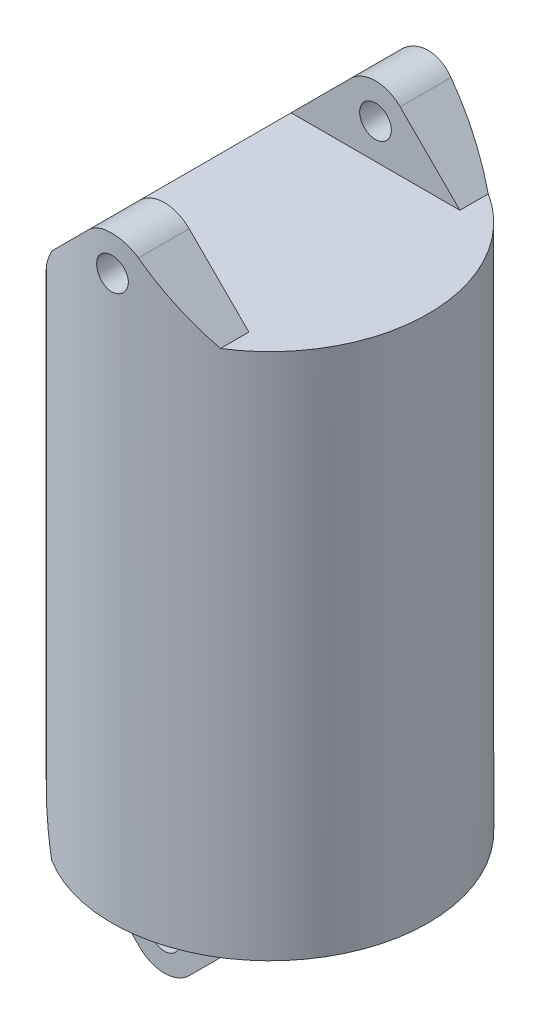
ISO-10303-21;
HEADER;
FILE_DESCRIPTION(('STEP AP214'),'2;1');
FILE_NAME('part.step','',(''),(''),'','','');
FILE_SCHEMA(('AUTOMOTIVE_DESIGN { 1 0 10303 214 1 1 1 1 }'));
ENDSEC;
DATA;
#1=APPLICATION_CONTEXT('core data for automotive mechanical design processes');
#2=APPLICATION_PROTOCOL_DEFINITION('international standard','automotive_design',2000,#1);
#3=PRODUCT_CONTEXT('',#1,'mechanical');
#4=PRODUCT('Part','Part','',(#3));
#5=PRODUCT_RELATED_PRODUCT_CATEGORY('part','',(#4));
#6=PRODUCT_DEFINITION_FORMATION('','',#4);
#7=PRODUCT_DEFINITION_CONTEXT('part definition',#1,'design');
#8=PRODUCT_DEFINITION('design','',#6,#7);
#9=PRODUCT_DEFINITION_SHAPE('','',#8);
#10=(LENGTH_UNIT() NAMED_UNIT(*) SI_UNIT(.MILLI.,.METRE.));
#11=(NAMED_UNIT(*) PLANE_ANGLE_UNIT() SI_UNIT($,.RADIAN.));
#12=(NAMED_UNIT(*) SI_UNIT($,.STERADIAN.) SOLID_ANGLE_UNIT());
#13=UNCERTAINTY_MEASURE_WITH_UNIT(LENGTH_MEASURE(1.E-05),#10,'distance_accuracy_value','');
#14=(GEOMETRIC_REPRESENTATION_CONTEXT(3) GLOBAL_UNCERTAINTY_ASSIGNED_CONTEXT((#13)) GLOBAL_UNIT_ASSIGNED_CONTEXT((#10,
#11,#12)) REPRESENTATION_CONTEXT('',''));
#15=CARTESIAN_POINT('',(0.,0.,0.));
#16=DIRECTION('',(0.,0.,1.));
#17=DIRECTION('',(1.,0.,0.));
#18=AXIS2_PLACEMENT_3D('',#15,#16,#17);
#19=CARTESIAN_POINT('',(8.,50.,15.));
#20=DIRECTION('',(-0.707106781186548,-0.707106781186547,0.));
#21=DIRECTION('',(0.707106781186547,-0.707106781186548,0.));
#22=AXIS2_PLACEMENT_3D('',#19,#20,#21);
#23=PLANE('',#22);
#24=DIRECTION('',(0.,0.,-1.));
#25=VECTOR('',#24,1.);
#26=CARTESIAN_POINT('',(2.34314575050762,55.6568542494924,15.));
#27=LINE('',#26,#25);
#28=CARTESIAN_POINT('',(2.34314575050762,55.6568542494924,14.8158586653585));
#29=VERTEX_POINT('',#28);
#30=CARTESIAN_POINT('',(2.34314575050762,55.6568542494924,10.));
#31=VERTEX_POINT('',#30);
#32=EDGE_CURVE('E167',#29,#31,#27,.T.);
#33=ORIENTED_EDGE('',*,*,#32,.F.);
#34=CARTESIAN_POINT('',(0.,58.,0.));
#35=DIRECTION('',(-0.707106781186548,-0.707106781186547,0.));
#36=DIRECTION('',(0.707106781186547,-0.707106781186548,0.));
#37=AXIS2_PLACEMENT_3D('',#34,#35,#36);
#38=ELLIPSE('',#37,21.2132034355964,15.);
#39=CARTESIAN_POINT('',(8.,50.,12.6885775404495));
#40=VERTEX_POINT('',#39);
#41=EDGE_CURVE('E165',#29,#40,#38,.F.);
#42=ORIENTED_EDGE('',*,*,#41,.T.);
#43=DIRECTION('',(0.,0.,-1.));
#44=VECTOR('',#43,1.);
#45=CARTESIAN_POINT('',(8.,50.,15.));
#46=LINE('',#45,#44);
#47=CARTESIAN_POINT('',(8.,50.,10.));
#48=VERTEX_POINT('',#47);
#49=EDGE_CURVE('E55',#40,#48,#46,.T.);
#50=ORIENTED_EDGE('',*,*,#49,.T.);
#51=DIRECTION('',(-0.707106781186547,0.707106781186548,0.));
#52=VECTOR('',#51,1.);
#53=CARTESIAN_POINT('',(8.,50.,10.));
#54=LINE('',#53,#52);
#55=EDGE_CURVE('E290',#48,#31,#54,.T.);
#56=ORIENTED_EDGE('',*,*,#55,.T.);
#57=EDGE_LOOP('',(#33,#42,#50,#56));
#58=FACE_BOUND('',#57,.T.);
#59=ADVANCED_FACE('F39',(#58),#23,.F.);
#60=CARTESIAN_POINT('',(-8.,50.,15.));
#61=DIRECTION('',(0.707106781186548,-0.707106781186547,0.));
#62=DIRECTION('',(0.707106781186547,0.707106781186548,0.));
#63=AXIS2_PLACEMENT_3D('',#60,#61,#62);
#64=PLANE('',#63);
#65=DIRECTION('',(0.,0.,1.));
#66=VECTOR('',#65,1.);
#67=CARTESIAN_POINT('',(-8.,50.,-25.));
#68=LINE('',#67,#66);
#69=CARTESIAN_POINT('',(-8.,50.,10.));
#70=VERTEX_POINT('',#69);
#71=CARTESIAN_POINT('',(-8.,50.,12.6885775404495));
#72=VERTEX_POINT('',#71);
#73=EDGE_CURVE('E272',#70,#72,#68,.T.);
#74=ORIENTED_EDGE('',*,*,#73,.T.);
#75=CARTESIAN_POINT('',(0.,58.,0.));
#76=DIRECTION('',(0.707106781186548,-0.707106781186547,0.));
#77=DIRECTION('',(-0.707106781186547,-0.707106781186548,0.));
#78=AXIS2_PLACEMENT_3D('',#75,#76,#77);
#79=ELLIPSE('',#78,21.2132034355964,15.);
#80=CARTESIAN_POINT('',(-2.34314575050762,55.6568542494924,14.8158586653585));
#81=VERTEX_POINT('',#80);
#82=EDGE_CURVE('E169',#72,#81,#79,.F.);
#83=ORIENTED_EDGE('',*,*,#82,.T.);
#84=DIRECTION('',(0.,0.,-1.));
#85=VECTOR('',#84,1.);
#86=CARTESIAN_POINT('',(-2.34314575050762,55.6568542494924,15.));
#87=LINE('',#86,#85);
#88=CARTESIAN_POINT('',(-2.34314575050762,55.6568542494924,10.));
#89=VERTEX_POINT('',#88);
#90=EDGE_CURVE('E276',#81,#89,#87,.T.);
#91=ORIENTED_EDGE('',*,*,#90,.T.);
#92=DIRECTION('',(-0.707106781186547,-0.707106781186548,0.));
#93=VECTOR('',#92,1.);
#94=CARTESIAN_POINT('',(-8.,50.,10.));
#95=LINE('',#94,#93);
#96=EDGE_CURVE('E283',#89,#70,#95,.T.);
#97=ORIENTED_EDGE('',*,*,#96,.T.);
#98=EDGE_LOOP('',(#74,#83,#91,#97));
#99=FACE_BOUND('',#98,.T.);
#100=ADVANCED_FACE('F356',(#99),#64,.F.);
#101=CARTESIAN_POINT('',(-8.,50.,-15.));
#102=DIRECTION('',(-0.707106781186548,0.707106781186547,0.));
#103=DIRECTION('',(-0.707106781186547,-0.707106781186548,0.));
#104=AXIS2_PLACEMENT_3D('',#101,#102,#103);
#105=PLANE('',#104);
#106=CARTESIAN_POINT('',(0.,58.,0.));
#107=DIRECTION('',(-0.707106781186548,0.707106781186547,0.));
#108=DIRECTION('',(-0.707106781186547,-0.707106781186548,0.));
#109=AXIS2_PLACEMENT_3D('',#106,#107,#108);
#110=ELLIPSE('',#109,21.2132034355964,15.);
#111=CARTESIAN_POINT('',(-8.,50.,-12.6885775404495));
#112=VERTEX_POINT('',#111);
#113=CARTESIAN_POINT('',(-2.34314575050762,55.6568542494924,-14.8158586653585));
#114=VERTEX_POINT('',#113);
#115=EDGE_CURVE('E342',#112,#114,#110,.F.);
#116=ORIENTED_EDGE('',*,*,#115,.F.);
#117=CARTESIAN_POINT('',(-8.,50.,-10.));
#118=VERTEX_POINT('',#117);
#119=EDGE_CURVE('E177',#112,#118,#68,.T.);
#120=ORIENTED_EDGE('',*,*,#119,.T.);
#121=DIRECTION('',(-0.707106781186547,-0.707106781186548,0.));
#122=VECTOR('',#121,1.);
#123=CARTESIAN_POINT('',(-8.,50.,-10.));
#124=LINE('',#123,#122);
#125=CARTESIAN_POINT('',(-2.34314575050762,55.6568542494924,-10.));
#126=VERTEX_POINT('',#125);
#127=EDGE_CURVE('E304',#126,#118,#124,.T.);
#128=ORIENTED_EDGE('',*,*,#127,.F.);
#129=DIRECTION('',(0.,0.,1.));
#130=VECTOR('',#129,1.);
#131=CARTESIAN_POINT('',(-2.34314575050762,55.6568542494924,-15.));
#132=LINE('',#131,#130);
#133=EDGE_CURVE('E291',#114,#126,#132,.T.);
#134=ORIENTED_EDGE('',*,*,#133,.F.);
#135=EDGE_LOOP('',(#116,#120,#128,#134));
#136=FACE_BOUND('',#135,.T.);
#137=ADVANCED_FACE('F355',(#136),#105,.T.);
#138=CARTESIAN_POINT('',(8.,50.,-15.));
#139=DIRECTION('',(0.707106781186548,0.707106781186547,0.));
#140=DIRECTION('',(-0.707106781186547,0.707106781186548,0.));
#141=AXIS2_PLACEMENT_3D('',#138,#139,#140);
#142=PLANE('',#141);
#143=CARTESIAN_POINT('',(0.,58.,0.));
#144=DIRECTION('',(0.707106781186548,0.707106781186547,0.));
#145=DIRECTION('',(0.707106781186547,-0.707106781186548,0.));
#146=AXIS2_PLACEMENT_3D('',#143,#144,#145);
#147=ELLIPSE('',#146,21.2132034355964,15.);
#148=CARTESIAN_POINT('',(2.34314575050762,55.6568542494924,-14.8158586653585));
#149=VERTEX_POINT('',#148);
#150=CARTESIAN_POINT('',(8.,50.,-12.6885775404495));
#151=VERTEX_POINT('',#150);
#152=EDGE_CURVE('E181',#149,#151,#147,.F.);
#153=ORIENTED_EDGE('',*,*,#152,.F.);
#154=DIRECTION('',(0.,0.,1.));
#155=VECTOR('',#154,1.);
#156=CARTESIAN_POINT('',(2.34314575050762,55.6568542494924,-15.));
#157=LINE('',#156,#155);
#158=CARTESIAN_POINT('',(2.34314575050762,55.6568542494924,-10.));
#159=VERTEX_POINT('',#158);
#160=EDGE_CURVE('E293',#149,#159,#157,.T.);
#161=ORIENTED_EDGE('',*,*,#160,.T.);
#162=DIRECTION('',(-0.707106781186547,0.707106781186548,0.));
#163=VECTOR('',#162,1.);
#164=CARTESIAN_POINT('',(8.,50.,-10.));
#165=LINE('',#164,#163);
#166=CARTESIAN_POINT('',(8.,50.,-10.));
#167=VERTEX_POINT('',#166);
#168=EDGE_CURVE('E300',#167,#159,#165,.T.);
#169=ORIENTED_EDGE('',*,*,#168,.F.);
#170=DIRECTION('',(0.,0.,1.));
#171=VECTOR('',#170,1.);
#172=CARTESIAN_POINT('',(8.,50.,-15.));
#173=LINE('',#172,#171);
#174=EDGE_CURVE('E299',#151,#167,#173,.T.);
#175=ORIENTED_EDGE('',*,*,#174,.F.);
#176=EDGE_LOOP('',(#153,#161,#169,#175));
#177=FACE_BOUND('',#176,.T.);
#178=ADVANCED_FACE('F352',(#177),#142,.T.);
#179=CARTESIAN_POINT('',(0.,50.,0.));
#180=DIRECTION('',(0.,1.,0.));
#181=DIRECTION('',(0.,0.,1.));
#182=AXIS2_PLACEMENT_3D('',#179,#180,#181);
#183=PLANE('',#182);
#184=DIRECTION('',(1.,0.,0.));
#185=VECTOR('',#184,1.);
#186=CARTESIAN_POINT('',(-8.,50.,-10.));
#187=LINE('',#186,#185);
#188=EDGE_CURVE('E306',#118,#167,#187,.T.);
#189=ORIENTED_EDGE('',*,*,#188,.F.);
#190=EDGE_CURVE('E277',#118,#70,#68,.T.);
#191=ORIENTED_EDGE('',*,*,#190,.T.);
#192=DIRECTION('',(1.,0.,0.));
#193=VECTOR('',#192,1.);
#194=CARTESIAN_POINT('',(-8.,50.,10.));
#195=LINE('',#194,#193);
#196=EDGE_CURVE('E178',#70,#48,#195,.T.);
#197=ORIENTED_EDGE('',*,*,#196,.T.);
#198=ORIENTED_EDGE('',*,*,#49,.F.);
#199=CARTESIAN_POINT('',(0.,50.,0.));
#200=DIRECTION('',(0.,1.,0.));
#201=DIRECTION('',(0.,0.,1.));
#202=AXIS2_PLACEMENT_3D('',#199,#200,#201);
#203=CIRCLE('',#202,15.);
#204=EDGE_CURVE('E176',#40,#151,#203,.T.);
#205=ORIENTED_EDGE('',*,*,#204,.T.);
#206=ORIENTED_EDGE('',*,*,#174,.T.);
#207=EDGE_LOOP('',(#189,#191,#197,#198,#205,#206));
#208=FACE_BOUND('',#207,.T.);
#209=ADVANCED_FACE('F175',(#208),#183,.T.);
#210=CARTESIAN_POINT('',(0.,50.,0.));
#211=DIRECTION('',(0.,-1.,0.));
#212=DIRECTION('',(0.,0.,-1.));
#213=AXIS2_PLACEMENT_3D('',#210,#211,#212);
#214=CYLINDRICAL_SURFACE('',#213,15.);
#215=CARTESIAN_POINT('',(0.,61.4285714285714,0.));
#216=DIRECTION('',(-0.819231920519041,0.573462344363328,0.));
#217=DIRECTION('',(-0.573462344363328,-0.819231920519041,0.));
#218=AXIS2_PLACEMENT_3D('',#215,#216,#217);
#219=ELLIPSE('',#218,26.1569048908579,15.);
#220=EDGE_CURVE('E271',#112,#72,#219,.T.);
#221=ORIENTED_EDGE('',*,*,#220,.F.);
#222=ORIENTED_EDGE('',*,*,#115,.T.);
#223=CARTESIAN_POINT('',(-2.34314575050762,55.6568542494924,-14.8158586653585));
#224=CARTESIAN_POINT('',(-2.27754723887448,55.7224626381488,-14.826235367359));
#225=CARTESIAN_POINT('',(-2.20918450395925,55.7853050774148,-14.8365983356945));
#226=CARTESIAN_POINT('',(-2.06740278834826,55.9050613766971,-14.857017158809));
#227=CARTESIAN_POINT('',(-1.99398362073629,55.9619750173537,-14.8670730022151));
#228=CARTESIAN_POINT('',(-1.84255351900328,56.0694811033568,-14.8865987506037));
#229=CARTESIAN_POINT('',(-1.76454182005448,56.1200724914065,-14.8960685574476));
#230=CARTESIAN_POINT('',(-1.60449826026799,56.2145526682944,-14.9141573547531));
#231=CARTESIAN_POINT('',(-1.52246653146007,56.2584416770641,-14.922776373129));
#232=CARTESIAN_POINT('',(-1.27097658943299,56.379625998432,-14.9470015885766));
#233=CARTESIAN_POINT('',(-1.09613648747234,56.4464294778265,-14.96097422498));
#234=CARTESIAN_POINT('',(-0.737539176319585,56.5496835869294,-14.9829338968404));
#235=CARTESIAN_POINT('',(-0.553787020546453,56.5861512099265,-14.9909242831334));
#236=CARTESIAN_POINT('',(-0.185428818930323,56.6273287078812,-14.999967146165));
#237=CARTESIAN_POINT('',(-0.000879252267977168,56.6325178292361,-15.0011243152053));
#238=CARTESIAN_POINT('',(0.366469876282627,56.612224879475,-14.996647993717));
#239=CARTESIAN_POINT('',(0.549269150667395,56.586737853737,-14.9910134062255));
#240=CARTESIAN_POINT('',(0.906050862274676,56.5063347689231,-14.9736665701828));
#241=CARTESIAN_POINT('',(1.08010220500503,56.4517098856106,-14.9620144907358));
#242=CARTESIAN_POINT('',(1.41656528712944,56.3148689045474,-14.9339158592992));
#243=CARTESIAN_POINT('',(1.57898000917779,56.2326599079755,-14.9174705414108));
#244=CARTESIAN_POINT('',(1.84417884209899,56.0698994727301,-14.8866210940528));
#245=CARTESIAN_POINT('',(1.95084657545154,55.9954410051119,-14.872952839138));
#246=CARTESIAN_POINT('',(2.15450627258592,55.834738145926,-14.8448209308308));
#247=CARTESIAN_POINT('',(2.25151338588301,55.7485127269128,-14.8303585797954));
#248=CARTESIAN_POINT('',(2.34314575050762,55.6568542494924,-14.8158586653585));
#249=B_SPLINE_CURVE_WITH_KNOTS('',3,(#223,#224,#225,#226,#227,#228,#229,#230,#231,#232,#233,
#234,#235,#236,#237,#238,#239,#240,#241,#242,#243,#244,#245,#246,#247,#248),.UNSPECIFIED.,.F.,
.F.,(4,2,2,2,2,2,2,2,2,2,2,2,4),(0.,0.279980478348737,0.559971312023267,0.840008907253277,
1.12003731137007,1.68014112615073,2.23993097492883,2.79112151651079,3.34240109493545,
3.88827217541475,4.43400283601175,4.82555923105611,5.21649159577395),.UNSPECIFIED.);
#250=EDGE_CURVE('E66',#114,#149,#249,.T.);
#251=ORIENTED_EDGE('',*,*,#250,.T.);
#252=ORIENTED_EDGE('',*,*,#152,.T.);
#253=ORIENTED_EDGE('',*,*,#204,.F.);
#254=ORIENTED_EDGE('',*,*,#41,.F.);
#255=CARTESIAN_POINT('',(-2.34314575050762,55.6568542494924,14.8158586653585));
#256=CARTESIAN_POINT('',(-2.27754723887448,55.7224626381488,14.826235367359));
#257=CARTESIAN_POINT('',(-2.20918450395925,55.7853050774148,14.8365983356945));
#258=CARTESIAN_POINT('',(-2.06740278834826,55.9050613766971,14.857017158809));
#259=CARTESIAN_POINT('',(-1.99398362073629,55.9619750173537,14.8670730022151));
#260=CARTESIAN_POINT('',(-1.84255351900328,56.0694811033568,14.8865987506037));
#261=CARTESIAN_POINT('',(-1.76454182005448,56.1200724914065,14.8960685574476));
#262=CARTESIAN_POINT('',(-1.60449826026799,56.2145526682944,14.9141573547531));
#263=CARTESIAN_POINT('',(-1.52246653146007,56.2584416770641,14.922776373129));
#264=CARTESIAN_POINT('',(-1.27097658943299,56.379625998432,14.9470015885766));
#265=CARTESIAN_POINT('',(-1.09613648747234,56.4464294778265,14.96097422498));
#266=CARTESIAN_POINT('',(-0.737539176319585,56.5496835869294,14.9829338968404));
#267=CARTESIAN_POINT('',(-0.553787020546453,56.5861512099265,14.9909242831334));
#268=CARTESIAN_POINT('',(-0.185428818930323,56.6273287078812,14.999967146165));
#269=CARTESIAN_POINT('',(-0.000879252267977168,56.6325178292361,15.0011243152053));
#270=CARTESIAN_POINT('',(0.366469876282627,56.612224879475,14.996647993717));
#271=CARTESIAN_POINT('',(0.549269150667395,56.586737853737,14.9910134062255));
#272=CARTESIAN_POINT('',(0.906050862274676,56.5063347689231,14.9736665701828));
#273=CARTESIAN_POINT('',(1.08010220500503,56.4517098856106,14.9620144907358));
#274=CARTESIAN_POINT('',(1.41656528712944,56.3148689045474,14.9339158592992));
#275=CARTESIAN_POINT('',(1.57898000917779,56.2326599079755,14.9174705414108));
#276=CARTESIAN_POINT('',(1.84417884209899,56.0698994727301,14.8866210940528));
#277=CARTESIAN_POINT('',(1.95084657545154,55.9954410051119,14.872952839138));
#278=CARTESIAN_POINT('',(2.15450627258592,55.834738145926,14.8448209308308));
#279=CARTESIAN_POINT('',(2.25151338588301,55.7485127269128,14.8303585797954));
#280=CARTESIAN_POINT('',(2.34314575050762,55.6568542494924,14.8158586653585));
#281=B_SPLINE_CURVE_WITH_KNOTS('',3,(#255,#256,#257,#258,#259,#260,#261,#262,#263,#264,#265,
#266,#267,#268,#269,#270,#271,#272,#273,#274,#275,#276,#277,#278,#279,#280),.UNSPECIFIED.,.F.,
.F.,(4,2,2,2,2,2,2,2,2,2,2,2,4),(0.,0.279980478348737,0.559971312023267,0.840008907253277,
1.12003731137007,1.68014112615073,2.23993097492883,2.79112151651079,3.34240109493545,
3.88827217541475,4.43400283601175,4.82555923105611,5.21649159577395),.UNSPECIFIED.);
#282=EDGE_CURVE('E56',#81,#29,#281,.T.);
#283=ORIENTED_EDGE('',*,*,#282,.F.);
#284=ORIENTED_EDGE('',*,*,#82,.F.);
#285=EDGE_LOOP('',(#221,#222,#251,#252,#253,#254,#283,#284));
#286=FACE_BOUND('',#285,.T.);
#287=CARTESIAN_POINT('',(0.,0.,0.));
#288=DIRECTION('',(0.,1.,0.));
#289=DIRECTION('',(0.,0.,1.));
#290=AXIS2_PLACEMENT_3D('',#287,#288,#289);
#291=CIRCLE('',#290,15.);
#292=CARTESIAN_POINT('',(-8.,0.,12.6885775404495));
#293=VERTEX_POINT('',#292);
#294=CARTESIAN_POINT('',(-8.,0.,-12.6885775404495));
#295=VERTEX_POINT('',#294);
#296=EDGE_CURVE('E188',#293,#295,#291,.T.);
#297=ORIENTED_EDGE('',*,*,#296,.T.);
#298=CARTESIAN_POINT('',(0.,-11.4285714285714,0.));
#299=DIRECTION('',(0.819231920519041,0.573462344363328,0.));
#300=DIRECTION('',(0.573462344363328,-0.819231920519041,0.));
#301=AXIS2_PLACEMENT_3D('',#298,#299,#300);
#302=ELLIPSE('',#301,26.1569048908579,15.);
#303=EDGE_CURVE('E268',#295,#293,#302,.T.);
#304=ORIENTED_EDGE('',*,*,#303,.T.);
#305=EDGE_LOOP('',(#297,#304));
#306=FACE_BOUND('',#305,.T.);
#307=CARTESIAN_POINT('',(0.,51.8137084989848,15.));
#308=CARTESIAN_POINT('',(-0.0840305306873358,51.8137121378353,14.9999990328115));
#309=CARTESIAN_POINT('',(-0.16811661775166,51.8207934023294,14.9992863839431));
#310=CARTESIAN_POINT('',(-0.333957597745256,51.8489350544204,14.9965120139211));
#311=CARTESIAN_POINT('',(-0.415709818753242,51.8700108430216,14.9944488065104));
#312=CARTESIAN_POINT('',(-0.574457513180122,51.9255218598815,14.9892062184461));
#313=CARTESIAN_POINT('',(-0.651455826922366,51.9599490197625,14.9860275120106));
#314=CARTESIAN_POINT('',(-0.798564241440612,52.0411698608822,14.9789093609146));
#315=CARTESIAN_POINT('',(-0.868675708168616,52.087961082985,14.974970067572));
#316=CARTESIAN_POINT('',(-1.00028932601112,52.1927625454782,14.9667561651199));
#317=CARTESIAN_POINT('',(-1.06176321725234,52.2508081980878,14.962480523608));
#318=CARTESIAN_POINT('',(-1.17411378214648,52.3763953003793,14.9540843535939));
#319=CARTESIAN_POINT('',(-1.22498996562398,52.4439371890483,14.9499638322738));
#320=CARTESIAN_POINT('',(-1.31480095566543,52.5867762965102,14.9423338732918));
#321=CARTESIAN_POINT('',(-1.35371019818232,52.662089665127,14.9388257506636));
#322=CARTESIAN_POINT('',(-1.41831957711414,52.8182218778422,14.9328305631979));
#323=CARTESIAN_POINT('',(-1.44402003988694,52.8990405858607,14.9303434731333));
#324=CARTESIAN_POINT('',(-1.48139856240284,53.0636012002838,14.9266812610947));
#325=CARTESIAN_POINT('',(-1.49312347950569,53.1473323642631,14.9255017559714));
#326=CARTESIAN_POINT('',(-1.50236292770304,53.3155817940784,14.9245746459079));
#327=CARTESIAN_POINT('',(-1.4998778323062,53.4001000391678,14.9248270033312));
#328=CARTESIAN_POINT('',(-1.48080642037902,53.5672014635247,14.926731103484));
#329=CARTESIAN_POINT('',(-1.46427126618683,53.6497905479778,14.9283777688598));
#330=CARTESIAN_POINT('',(-1.41764871622588,53.8110154437864,14.9328770143113));
#331=CARTESIAN_POINT('',(-1.38756113738362,53.8896512017223,14.9357296106774));
#332=CARTESIAN_POINT('',(-1.31463134082226,54.0408988799331,14.9423251417811));
#333=CARTESIAN_POINT('',(-1.27176642407996,54.1134997832187,14.9460696586224));
#334=CARTESIAN_POINT('',(-1.17451504102984,54.2504963213526,14.9540257759932));
#335=CARTESIAN_POINT('',(-1.12012823750476,54.3148917159574,14.9582373901918));
#336=CARTESIAN_POINT('',(-1.0010911686181,54.4339465899683,14.9666757796948));
#337=CARTESIAN_POINT('',(-0.936396718277042,54.488561901806,14.970902539995));
#338=CARTESIAN_POINT('',(-0.798734222605666,54.5861639483503,14.9788774361778));
#339=CARTESIAN_POINT('',(-0.7257661679994,54.6291506700195,14.9826255715238));
#340=CARTESIAN_POINT('',(-0.573597158538546,54.7022735294501,14.9892221350064));
#341=CARTESIAN_POINT('',(-0.494395119584852,54.7324074262119,14.9920704062215));
#342=CARTESIAN_POINT('',(-0.332020825994894,54.7789368740524,14.9965447116211));
#343=CARTESIAN_POINT('',(-0.248848690164897,54.7953328359707,14.998170782356));
#344=CARTESIAN_POINT('',(-0.0812776486378528,54.8138649605869,15.0000127750247));
#345=CARTESIAN_POINT('',(0.00311445315824065,54.8160620713635,15.000234724016));
#346=CARTESIAN_POINT('',(0.171065689973553,54.8062942044116,14.999259626352));
#347=CARTESIAN_POINT('',(0.254624836230708,54.7943294180118,14.998062598867));
#348=CARTESIAN_POINT('',(0.418362310252015,54.7566279558524,14.9943879230879));
#349=CARTESIAN_POINT('',(0.498547273458032,54.7309198172677,14.9919129287706));
#350=CARTESIAN_POINT('',(0.653466482075675,54.6664907379288,14.9859599829091));
#351=CARTESIAN_POINT('',(0.728200605235679,54.6277695054257,14.9824820088788));
#352=CARTESIAN_POINT('',(0.870372270258216,54.5382622409889,14.9748971299563));
#353=CARTESIAN_POINT('',(0.937784489623378,54.487436165596,14.9707881540516));
#354=CARTESIAN_POINT('',(1.06314243496782,54.3752193973734,14.9624089930428));
#355=CARTESIAN_POINT('',(1.12108792327377,54.3138284393793,14.9581388038946));
#356=CARTESIAN_POINT('',(1.22607916483072,54.1819586369962,14.9499003621113));
#357=CARTESIAN_POINT('',(1.27308491801932,54.1114478641708,14.9459332520846));
#358=CARTESIAN_POINT('',(1.35458738811574,53.9634974587647,14.9387674869133));
#359=CARTESIAN_POINT('',(1.38908427608082,53.8860579209522,14.9355688212606));
#360=CARTESIAN_POINT('',(1.44452281302671,53.7265853897861,14.9303092145107));
#361=CARTESIAN_POINT('',(1.46548826221779,53.6445607388481,14.9282462767468));
#362=CARTESIAN_POINT('',(1.49334601069419,53.4781337020436,14.9254854792431));
#363=CARTESIAN_POINT('',(1.50023871359928,53.3937313844412,14.9247875803528));
#364=CARTESIAN_POINT('',(1.49974970770688,53.2253424664497,14.9248366966134));
#365=CARTESIAN_POINT('',(1.49243083438967,53.1413556746605,14.9255773513051));
#366=CARTESIAN_POINT('',(1.46385817944548,52.9758111232323,14.9284065583432));
#367=CARTESIAN_POINT('',(1.44260438214324,52.8942533663258,14.9304951122058));
#368=CARTESIAN_POINT('',(1.38678252944625,52.735882475413,14.9357830239478));
#369=CARTESIAN_POINT('',(1.35221631651138,52.6590686865402,14.9389822281054));
#370=CARTESIAN_POINT('',(1.27075733236657,52.5123231614782,14.9461312775904));
#371=CARTESIAN_POINT('',(1.22386463018312,52.4423913867538,14.9500811187143));
#372=CARTESIAN_POINT('',(1.118847834428,52.3110729872769,14.9583073081455));
#373=CARTESIAN_POINT('',(1.06067692333541,52.2497238844341,14.9625849709013));
#374=CARTESIAN_POINT('',(0.93484754883767,52.1376301499353,14.9709728209317));
#375=CARTESIAN_POINT('',(0.86718681616239,52.086888061949,14.9750829678446));
#376=CARTESIAN_POINT('',(0.724112151241936,51.9973483182028,14.9826834310374));
#377=CARTESIAN_POINT('',(0.648679124020145,51.958581062567,14.9861721604022));
#378=CARTESIAN_POINT('',(0.492387418650823,51.8943148647489,14.9921194387484));
#379=CARTESIAN_POINT('',(0.411534974738411,51.8688009625544,14.9945791486448));
#380=CARTESIAN_POINT('',(0.275187392108554,51.8381275733576,14.997573206606));
#381=CARTESIAN_POINT('',(0.220563829266762,51.8289829325357,14.9984790103775));
#382=CARTESIAN_POINT('',(0.110634871225969,51.8167722098921,14.9996927242618));
#383=CARTESIAN_POINT('',(0.0553294788398365,51.813706103002,15.0000006368404));
#384=CARTESIAN_POINT('',(0.,51.8137084989848,15.));
#385=B_SPLINE_CURVE_WITH_KNOTS('',3,(#307,#308,#309,#310,#311,#312,#313,#314,#315,#316,#317,
#318,#319,#320,#321,#322,#323,#324,#325,#326,#327,#328,#329,#330,#331,#332,#333,#334,#335,#336,
#337,#338,#339,#340,#341,#342,#343,#344,#345,#346,#347,#348,#349,#350,#351,#352,#353,#354,#355,
#356,#357,#358,#359,#360,#361,#362,#363,#364,#365,#366,#367,#368,#369,#370,#371,#372,#373,#374,
#375,#376,#377,#378,#379,#380,#381,#382,#383,#384),.UNSPECIFIED.,.T.,.F.,(4,2,2,2,2,2,2,2,2,2,2,
2,2,2,2,2,2,2,2,2,2,2,2,2,2,2,2,2,2,2,2,2,2,2,2,2,2,2,4),(0.,0.25188954940271,0.504056764253232,
0.756071828598305,1.00803680637418,1.26080785293442,1.51359058831059,1.76690963208333,
2.02022241663756,2.27268348067795,2.52513790883665,2.77667696161666,3.02821941242451,
3.28021142059342,3.53221080496688,3.7853210129431,4.03843150469658,4.29158611040372,
4.5447331451316,4.79679282911637,5.04884910778715,5.30038402941457,5.55192459074201,
5.80430911123048,6.05669996715345,6.30999965412898,6.56329587713061,6.81614535889505,
7.06898758859378,7.32071443940935,7.57244157339059,7.824133880442,8.0758247780844,
8.32858376141479,8.58140328955436,8.83485946539364,9.08802892192943,9.25388500848523,
9.41974041103541),.UNSPECIFIED.);
#386=CARTESIAN_POINT('',(0.,51.8137084989848,15.));
#387=VERTEX_POINT('',#386);
#388=EDGE_CURVE('E166',#387,#387,#385,.T.);
#389=ORIENTED_EDGE('',*,*,#388,.T.);
#390=EDGE_LOOP('',(#389));
#391=FACE_BOUND('',#390,.T.);
#392=CARTESIAN_POINT('',(0.,51.8137084989848,-15.));
#393=CARTESIAN_POINT('',(-0.0840305306873358,51.8137121378353,-14.9999990328115));
#394=CARTESIAN_POINT('',(-0.16811661775166,51.8207934023294,-14.9992863839431));
#395=CARTESIAN_POINT('',(-0.333957597745256,51.8489350544204,-14.9965120139211));
#396=CARTESIAN_POINT('',(-0.415709818753242,51.8700108430216,-14.9944488065104));
#397=CARTESIAN_POINT('',(-0.574457513180122,51.9255218598815,-14.9892062184461));
#398=CARTESIAN_POINT('',(-0.651455826922366,51.9599490197625,-14.9860275120106));
#399=CARTESIAN_POINT('',(-0.798564241440612,52.0411698608822,-14.9789093609146));
#400=CARTESIAN_POINT('',(-0.868675708168616,52.087961082985,-14.974970067572));
#401=CARTESIAN_POINT('',(-1.00028932601112,52.1927625454782,-14.9667561651199));
#402=CARTESIAN_POINT('',(-1.06176321725234,52.2508081980878,-14.962480523608));
#403=CARTESIAN_POINT('',(-1.17411378214648,52.3763953003793,-14.9540843535939));
#404=CARTESIAN_POINT('',(-1.22498996562398,52.4439371890483,-14.9499638322738));
#405=CARTESIAN_POINT('',(-1.31480095566543,52.5867762965102,-14.9423338732918));
#406=CARTESIAN_POINT('',(-1.35371019818232,52.662089665127,-14.9388257506636));
#407=CARTESIAN_POINT('',(-1.41831957711414,52.8182218778422,-14.9328305631979));
#408=CARTESIAN_POINT('',(-1.44402003988694,52.8990405858607,-14.9303434731333));
#409=CARTESIAN_POINT('',(-1.48139856240284,53.0636012002838,-14.9266812610947));
#410=CARTESIAN_POINT('',(-1.49312347950569,53.1473323642631,-14.9255017559714));
#411=CARTESIAN_POINT('',(-1.50236292770304,53.3155817940784,-14.9245746459079));
#412=CARTESIAN_POINT('',(-1.4998778323062,53.4001000391678,-14.9248270033312));
#413=CARTESIAN_POINT('',(-1.48080642037902,53.5672014635247,-14.926731103484));
#414=CARTESIAN_POINT('',(-1.46427126618683,53.6497905479778,-14.9283777688598));
#415=CARTESIAN_POINT('',(-1.41764871622588,53.8110154437864,-14.9328770143113));
#416=CARTESIAN_POINT('',(-1.38756113738362,53.8896512017223,-14.9357296106774));
#417=CARTESIAN_POINT('',(-1.31463134082226,54.0408988799331,-14.9423251417811));
#418=CARTESIAN_POINT('',(-1.27176642407996,54.1134997832187,-14.9460696586224));
#419=CARTESIAN_POINT('',(-1.17451504102984,54.2504963213526,-14.9540257759932));
#420=CARTESIAN_POINT('',(-1.12012823750476,54.3148917159574,-14.9582373901918));
#421=CARTESIAN_POINT('',(-1.0010911686181,54.4339465899683,-14.9666757796948));
#422=CARTESIAN_POINT('',(-0.936396718277042,54.488561901806,-14.970902539995));
#423=CARTESIAN_POINT('',(-0.798734222605666,54.5861639483503,-14.9788774361778));
#424=CARTESIAN_POINT('',(-0.7257661679994,54.6291506700195,-14.9826255715238));
#425=CARTESIAN_POINT('',(-0.573597158538546,54.7022735294501,-14.9892221350064));
#426=CARTESIAN_POINT('',(-0.494395119584852,54.7324074262119,-14.9920704062215));
#427=CARTESIAN_POINT('',(-0.332020825994894,54.7789368740524,-14.9965447116211));
#428=CARTESIAN_POINT('',(-0.248848690164897,54.7953328359707,-14.998170782356));
#429=CARTESIAN_POINT('',(-0.0812776486378528,54.8138649605869,-15.0000127750247));
#430=CARTESIAN_POINT('',(0.00311445315824065,54.8160620713635,-15.000234724016));
#431=CARTESIAN_POINT('',(0.171065689973553,54.8062942044116,-14.999259626352));
#432=CARTESIAN_POINT('',(0.254624836230708,54.7943294180118,-14.998062598867));
#433=CARTESIAN_POINT('',(0.418362310252015,54.7566279558524,-14.9943879230879));
#434=CARTESIAN_POINT('',(0.498547273458032,54.7309198172677,-14.9919129287706));
#435=CARTESIAN_POINT('',(0.653466482075675,54.6664907379288,-14.9859599829091));
#436=CARTESIAN_POINT('',(0.728200605235679,54.6277695054257,-14.9824820088788));
#437=CARTESIAN_POINT('',(0.870372270258216,54.5382622409889,-14.9748971299563));
#438=CARTESIAN_POINT('',(0.937784489623378,54.487436165596,-14.9707881540516));
#439=CARTESIAN_POINT('',(1.06314243496782,54.3752193973734,-14.9624089930428));
#440=CARTESIAN_POINT('',(1.12108792327377,54.3138284393793,-14.9581388038946));
#441=CARTESIAN_POINT('',(1.22607916483072,54.1819586369962,-14.9499003621113));
#442=CARTESIAN_POINT('',(1.27308491801932,54.1114478641708,-14.9459332520846));
#443=CARTESIAN_POINT('',(1.35458738811574,53.9634974587647,-14.9387674869133));
#444=CARTESIAN_POINT('',(1.38908427608082,53.8860579209522,-14.9355688212606));
#445=CARTESIAN_POINT('',(1.44452281302671,53.7265853897861,-14.9303092145107));
#446=CARTESIAN_POINT('',(1.46548826221779,53.6445607388481,-14.9282462767468));
#447=CARTESIAN_POINT('',(1.49334601069419,53.4781337020436,-14.9254854792431));
#448=CARTESIAN_POINT('',(1.50023871359928,53.3937313844412,-14.9247875803528));
#449=CARTESIAN_POINT('',(1.49974970770688,53.2253424664497,-14.9248366966134));
#450=CARTESIAN_POINT('',(1.49243083438967,53.1413556746605,-14.9255773513051));
#451=CARTESIAN_POINT('',(1.46385817944548,52.9758111232323,-14.9284065583432));
#452=CARTESIAN_POINT('',(1.44260438214324,52.8942533663258,-14.9304951122058));
#453=CARTESIAN_POINT('',(1.38678252944625,52.735882475413,-14.9357830239478));
#454=CARTESIAN_POINT('',(1.35221631651138,52.6590686865402,-14.9389822281054));
#455=CARTESIAN_POINT('',(1.27075733236657,52.5123231614782,-14.9461312775904));
#456=CARTESIAN_POINT('',(1.22386463018312,52.4423913867538,-14.9500811187143));
#457=CARTESIAN_POINT('',(1.118847834428,52.3110729872769,-14.9583073081455));
#458=CARTESIAN_POINT('',(1.06067692333541,52.2497238844341,-14.9625849709013));
#459=CARTESIAN_POINT('',(0.93484754883767,52.1376301499353,-14.9709728209317));
#460=CARTESIAN_POINT('',(0.86718681616239,52.086888061949,-14.9750829678446));
#461=CARTESIAN_POINT('',(0.724112151241936,51.9973483182028,-14.9826834310374));
#462=CARTESIAN_POINT('',(0.648679124020145,51.958581062567,-14.9861721604022));
#463=CARTESIAN_POINT('',(0.492387418650823,51.8943148647489,-14.9921194387484));
#464=CARTESIAN_POINT('',(0.411534974738411,51.8688009625544,-14.9945791486448));
#465=CARTESIAN_POINT('',(0.275187392108554,51.8381275733576,-14.997573206606));
#466=CARTESIAN_POINT('',(0.220563829266762,51.8289829325357,-14.9984790103775));
#467=CARTESIAN_POINT('',(0.110634871225969,51.8167722098921,-14.9996927242618));
#468=CARTESIAN_POINT('',(0.0553294788398365,51.813706103002,-15.0000006368404));
#469=CARTESIAN_POINT('',(0.,51.8137084989848,-15.));
#470=B_SPLINE_CURVE_WITH_KNOTS('',3,(#392,#393,#394,#395,#396,#397,#398,#399,#400,#401,#402,
#403,#404,#405,#406,#407,#408,#409,#410,#411,#412,#413,#414,#415,#416,#417,#418,#419,#420,#421,
#422,#423,#424,#425,#426,#427,#428,#429,#430,#431,#432,#433,#434,#435,#436,#437,#438,#439,#440,
#441,#442,#443,#444,#445,#446,#447,#448,#449,#450,#451,#452,#453,#454,#455,#456,#457,#458,#459,
#460,#461,#462,#463,#464,#465,#466,#467,#468,#469),.UNSPECIFIED.,.T.,.F.,(4,2,2,2,2,2,2,2,2,2,2,
2,2,2,2,2,2,2,2,2,2,2,2,2,2,2,2,2,2,2,2,2,2,2,2,2,2,2,4),(0.,0.25188954940271,0.504056764253232,
0.756071828598305,1.00803680637418,1.26080785293442,1.51359058831059,1.76690963208333,
2.02022241663756,2.27268348067795,2.52513790883665,2.77667696161666,3.02821941242451,
3.28021142059342,3.53221080496688,3.7853210129431,4.03843150469658,4.29158611040372,
4.5447331451316,4.79679282911637,5.04884910778715,5.30038402941457,5.55192459074201,
5.80430911123048,6.05669996715345,6.30999965412898,6.56329587713061,6.81614535889505,
7.06898758859378,7.32071443940935,7.57244157339059,7.824133880442,8.0758247780844,
8.32858376141479,8.58140328955436,8.83485946539364,9.08802892192943,9.25388500848523,
9.41974041103541),.UNSPECIFIED.);
#471=CARTESIAN_POINT('',(0.,51.8137084989848,-15.));
#472=VERTEX_POINT('',#471);
#473=EDGE_CURVE('E11',#472,#472,#470,.T.);
#474=ORIENTED_EDGE('',*,*,#473,.F.);
#475=EDGE_LOOP('',(#474));
#476=FACE_BOUND('',#475,.T.);
#477=ADVANCED_FACE('F41',(#286,#306,#391,#476),#214,.T.);
#478=CARTESIAN_POINT('',(0.,0.,0.));
#479=DIRECTION('',(0.,1.,0.));
#480=DIRECTION('',(0.,0.,1.));
#481=AXIS2_PLACEMENT_3D('',#478,#479,#480);
#482=PLANE('',#481);
#483=DIRECTION('',(0.,0.,1.));
#484=VECTOR('',#483,1.);
#485=CARTESIAN_POINT('',(-8.,0.,-25.));
#486=LINE('',#485,#484);
#487=CARTESIAN_POINT('',(-8.,0.,-10.));
#488=VERTEX_POINT('',#487);
#489=EDGE_CURVE('E191',#295,#488,#486,.T.);
#490=ORIENTED_EDGE('',*,*,#489,.F.);
#491=ORIENTED_EDGE('',*,*,#296,.F.);
#492=CARTESIAN_POINT('',(-8.,0.,10.));
#493=VERTEX_POINT('',#492);
#494=EDGE_CURVE('E183',#493,#293,#486,.T.);
#495=ORIENTED_EDGE('',*,*,#494,.F.);
#496=DIRECTION('',(-1.,0.,0.));
#497=VECTOR('',#496,1.);
#498=CARTESIAN_POINT('',(-8.,0.,10.));
#499=LINE('',#498,#497);
#500=CARTESIAN_POINT('',(8.,0.,10.));
#501=VERTEX_POINT('',#500);
#502=EDGE_CURVE('E209',#501,#493,#499,.T.);
#503=ORIENTED_EDGE('',*,*,#502,.F.);
#504=DIRECTION('',(0.,0.,-1.));
#505=VECTOR('',#504,1.);
#506=CARTESIAN_POINT('',(8.,0.,10.));
#507=LINE('',#506,#505);
#508=CARTESIAN_POINT('',(8.,0.,5.));
#509=VERTEX_POINT('',#508);
#510=EDGE_CURVE('E201',#501,#509,#507,.T.);
#511=ORIENTED_EDGE('',*,*,#510,.T.);
#512=DIRECTION('',(-1.,0.,0.));
#513=VECTOR('',#512,1.);
#514=CARTESIAN_POINT('',(-8.,0.,5.));
#515=LINE('',#514,#513);
#516=CARTESIAN_POINT('',(-8.,0.,5.));
#517=VERTEX_POINT('',#516);
#518=EDGE_CURVE('E214',#509,#517,#515,.T.);
#519=ORIENTED_EDGE('',*,*,#518,.T.);
#520=CARTESIAN_POINT('',(-8.,0.,-5.));
#521=VERTEX_POINT('',#520);
#522=EDGE_CURVE('E190',#521,#517,#486,.T.);
#523=ORIENTED_EDGE('',*,*,#522,.F.);
#524=DIRECTION('',(-1.,0.,0.));
#525=VECTOR('',#524,1.);
#526=CARTESIAN_POINT('',(-8.,0.,-5.));
#527=LINE('',#526,#525);
#528=CARTESIAN_POINT('',(8.,0.,-5.));
#529=VERTEX_POINT('',#528);
#530=EDGE_CURVE('E253',#529,#521,#527,.T.);
#531=ORIENTED_EDGE('',*,*,#530,.F.);
#532=DIRECTION('',(0.,0.,1.));
#533=VECTOR('',#532,1.);
#534=CARTESIAN_POINT('',(8.,0.,-10.));
#535=LINE('',#534,#533);
#536=CARTESIAN_POINT('',(8.,0.,-10.));
#537=VERTEX_POINT('',#536);
#538=EDGE_CURVE('E230',#537,#529,#535,.T.);
#539=ORIENTED_EDGE('',*,*,#538,.F.);
#540=DIRECTION('',(-1.,0.,0.));
#541=VECTOR('',#540,1.);
#542=CARTESIAN_POINT('',(-8.,0.,-10.));
#543=LINE('',#542,#541);
#544=EDGE_CURVE('E245',#537,#488,#543,.T.);
#545=ORIENTED_EDGE('',*,*,#544,.T.);
#546=EDGE_LOOP('',(#490,#491,#495,#503,#511,#519,#523,#531,#539,#545));
#547=FACE_BOUND('',#546,.T.);
#548=ADVANCED_FACE('F394',(#547),#482,.F.);
#549=CARTESIAN_POINT('',(-8.,0.,10.));
#550=DIRECTION('',(0.707106781186548,0.707106781186548,0.));
#551=DIRECTION('',(-0.707106781186548,0.707106781186548,0.));
#552=AXIS2_PLACEMENT_3D('',#549,#550,#551);
#553=PLANE('',#552);
#554=DIRECTION('',(0.707106781186547,-0.707106781186547,0.));
#555=VECTOR('',#554,1.);
#556=CARTESIAN_POINT('',(-8.,0.,5.));
#557=LINE('',#556,#555);
#558=CARTESIAN_POINT('',(-2.34314575050762,-5.65685424949238,5.));
#559=VERTEX_POINT('',#558);
#560=EDGE_CURVE('E213',#517,#559,#557,.T.);
#561=ORIENTED_EDGE('',*,*,#560,.T.);
#562=DIRECTION('',(0.,0.,-1.));
#563=VECTOR('',#562,1.);
#564=CARTESIAN_POINT('',(-2.34314575050762,-5.65685424949238,10.));
#565=LINE('',#564,#563);
#566=CARTESIAN_POINT('',(-2.34314575050762,-5.65685424949238,10.));
#567=VERTEX_POINT('',#566);
#568=EDGE_CURVE('E197',#567,#559,#565,.T.);
#569=ORIENTED_EDGE('',*,*,#568,.F.);
#570=DIRECTION('',(0.707106781186547,-0.707106781186547,0.));
#571=VECTOR('',#570,1.);
#572=CARTESIAN_POINT('',(-8.,0.,10.));
#573=LINE('',#572,#571);
#574=EDGE_CURVE('E225',#493,#567,#573,.T.);
#575=ORIENTED_EDGE('',*,*,#574,.F.);
#576=DIRECTION('',(0.,0.,-1.));
#577=VECTOR('',#576,1.);
#578=CARTESIAN_POINT('',(-8.,0.,10.));
#579=LINE('',#578,#577);
#580=EDGE_CURVE('E193',#493,#517,#579,.T.);
#581=ORIENTED_EDGE('',*,*,#580,.T.);
#582=EDGE_LOOP('',(#561,#569,#575,#581));
#583=FACE_BOUND('',#582,.T.);
#584=ADVANCED_FACE('F395',(#583),#553,.F.);
#585=CARTESIAN_POINT('',(0.,-3.31370849898476,10.));
#586=DIRECTION('',(0.,0.,-1.));
#587=DIRECTION('',(-1.,0.,0.));
#588=AXIS2_PLACEMENT_3D('',#585,#586,#587);
#589=CYLINDRICAL_SURFACE('',#588,3.31370849898476);
#590=CARTESIAN_POINT('',(0.,-3.31370849898476,5.));
#591=DIRECTION('',(0.,0.,1.));
#592=DIRECTION('',(1.,0.,0.));
#593=AXIS2_PLACEMENT_3D('',#590,#591,#592);
#594=CIRCLE('',#593,3.31370849898476);
#595=CARTESIAN_POINT('',(2.34314575050762,-5.65685424949238,5.));
#596=VERTEX_POINT('',#595);
#597=EDGE_CURVE('E211',#559,#596,#594,.T.);
#598=ORIENTED_EDGE('',*,*,#597,.T.);
#599=DIRECTION('',(0.,0.,-1.));
#600=VECTOR('',#599,1.);
#601=CARTESIAN_POINT('',(2.34314575050762,-5.65685424949238,10.));
#602=LINE('',#601,#600);
#603=CARTESIAN_POINT('',(2.34314575050762,-5.65685424949238,10.));
#604=VERTEX_POINT('',#603);
#605=EDGE_CURVE('E199',#604,#596,#602,.T.);
#606=ORIENTED_EDGE('',*,*,#605,.F.);
#607=CARTESIAN_POINT('',(0.,-3.31370849898476,10.));
#608=DIRECTION('',(0.,0.,1.));
#609=DIRECTION('',(1.,0.,0.));
#610=AXIS2_PLACEMENT_3D('',#607,#608,#609);
#611=CIRCLE('',#610,3.31370849898476);
#612=EDGE_CURVE('E219',#567,#604,#611,.T.);
#613=ORIENTED_EDGE('',*,*,#612,.F.);
#614=ORIENTED_EDGE('',*,*,#568,.T.);
#615=EDGE_LOOP('',(#598,#606,#613,#614));
#616=FACE_BOUND('',#615,.T.);
#617=ADVANCED_FACE('F405',(#616),#589,.T.);
#618=CARTESIAN_POINT('',(8.,0.,10.));
#619=DIRECTION('',(-0.707106781186548,0.707106781186548,0.));
#620=DIRECTION('',(-0.707106781186548,-0.707106781186548,0.));
#621=AXIS2_PLACEMENT_3D('',#618,#619,#620);
#622=PLANE('',#621);
#623=DIRECTION('',(0.707106781186547,0.707106781186547,0.));
#624=VECTOR('',#623,1.);
#625=CARTESIAN_POINT('',(8.,0.,5.));
#626=LINE('',#625,#624);
#627=EDGE_CURVE('E210',#596,#509,#626,.T.);
#628=ORIENTED_EDGE('',*,*,#627,.T.);
#629=ORIENTED_EDGE('',*,*,#510,.F.);
#630=DIRECTION('',(0.707106781186547,0.707106781186547,0.));
#631=VECTOR('',#630,1.);
#632=CARTESIAN_POINT('',(8.,0.,10.));
#633=LINE('',#632,#631);
#634=EDGE_CURVE('E206',#604,#501,#633,.T.);
#635=ORIENTED_EDGE('',*,*,#634,.F.);
#636=ORIENTED_EDGE('',*,*,#605,.T.);
#637=EDGE_LOOP('',(#628,#629,#635,#636));
#638=FACE_BOUND('',#637,.T.);
#639=ADVANCED_FACE('F425',(#638),#622,.F.);
#640=CARTESIAN_POINT('',(0.,-3.31370849898476,10.));
#641=DIRECTION('',(0.,0.,1.));
#642=DIRECTION('',(1.,0.,0.));
#643=AXIS2_PLACEMENT_3D('',#640,#641,#642);
#644=PLANE('',#643);
#645=CARTESIAN_POINT('',(0.,-3.31370849898476,10.));
#646=DIRECTION('',(0.,0.,1.));
#647=DIRECTION('',(1.,0.,0.));
#648=AXIS2_PLACEMENT_3D('',#645,#646,#647);
#649=CIRCLE('',#648,1.5);
#650=CARTESIAN_POINT('',(1.5,-3.31370849898476,10.));
#651=VERTEX_POINT('',#650);
#652=EDGE_CURVE('E228',#651,#651,#649,.T.);
#653=ORIENTED_EDGE('',*,*,#652,.F.);
#654=EDGE_LOOP('',(#653));
#655=FACE_BOUND('',#654,.T.);
#656=ORIENTED_EDGE('',*,*,#502,.T.);
#657=ORIENTED_EDGE('',*,*,#574,.T.);
#658=ORIENTED_EDGE('',*,*,#612,.T.);
#659=ORIENTED_EDGE('',*,*,#634,.T.);
#660=EDGE_LOOP('',(#656,#657,#658,#659));
#661=FACE_BOUND('',#660,.T.);
#662=ADVANCED_FACE('F417',(#655,#661),#644,.T.);
#663=CARTESIAN_POINT('',(0.,-3.31370849898476,5.));
#664=DIRECTION('',(0.,0.,1.));
#665=DIRECTION('',(1.,0.,0.));
#666=AXIS2_PLACEMENT_3D('',#663,#664,#665);
#667=PLANE('',#666);
#668=CARTESIAN_POINT('',(0.,-3.31370849898476,5.));
#669=DIRECTION('',(0.,0.,1.));
#670=DIRECTION('',(1.,0.,0.));
#671=AXIS2_PLACEMENT_3D('',#668,#669,#670);
#672=CIRCLE('',#671,1.5);
#673=CARTESIAN_POINT('',(1.5,-3.31370849898476,5.));
#674=VERTEX_POINT('',#673);
#675=EDGE_CURVE('E217',#674,#674,#672,.T.);
#676=ORIENTED_EDGE('',*,*,#675,.T.);
#677=EDGE_LOOP('',(#676));
#678=FACE_BOUND('',#677,.T.);
#679=ORIENTED_EDGE('',*,*,#518,.F.);
#680=ORIENTED_EDGE('',*,*,#627,.F.);
#681=ORIENTED_EDGE('',*,*,#597,.F.);
#682=ORIENTED_EDGE('',*,*,#560,.F.);
#683=EDGE_LOOP('',(#679,#680,#681,#682));
#684=FACE_BOUND('',#683,.T.);
#685=ADVANCED_FACE('F430',(#678,#684),#667,.F.);
#686=CARTESIAN_POINT('',(0.,-3.31370849898476,5.));
#687=DIRECTION('',(0.,0.,1.));
#688=DIRECTION('',(1.,0.,0.));
#689=AXIS2_PLACEMENT_3D('',#686,#687,#688);
#690=CYLINDRICAL_SURFACE('',#689,1.5);
#691=ORIENTED_EDGE('',*,*,#675,.F.);
#692=EDGE_LOOP('',(#691));
#693=FACE_BOUND('',#692,.T.);
#694=ORIENTED_EDGE('',*,*,#652,.T.);
#695=EDGE_LOOP('',(#694));
#696=FACE_BOUND('',#695,.T.);
#697=ADVANCED_FACE('F437',(#693,#696),#690,.F.);
#698=CARTESIAN_POINT('',(8.,0.,-10.));
#699=DIRECTION('',(0.707106781186548,-0.707106781186548,0.));
#700=DIRECTION('',(0.707106781186548,0.707106781186548,0.));
#701=AXIS2_PLACEMENT_3D('',#698,#699,#700);
#702=PLANE('',#701);
#703=DIRECTION('',(0.707106781186547,0.707106781186547,0.));
#704=VECTOR('',#703,1.);
#705=CARTESIAN_POINT('',(8.,0.,-5.));
#706=LINE('',#705,#704);
#707=CARTESIAN_POINT('',(2.34314575050762,-5.65685424949238,-5.));
#708=VERTEX_POINT('',#707);
#709=EDGE_CURVE('E248',#708,#529,#706,.T.);
#710=ORIENTED_EDGE('',*,*,#709,.F.);
#711=DIRECTION('',(0.,0.,1.));
#712=VECTOR('',#711,1.);
#713=CARTESIAN_POINT('',(2.34314575050762,-5.65685424949238,-10.));
#714=LINE('',#713,#712);
#715=CARTESIAN_POINT('',(2.34314575050762,-5.65685424949238,-10.));
#716=VERTEX_POINT('',#715);
#717=EDGE_CURVE('E232',#716,#708,#714,.T.);
#718=ORIENTED_EDGE('',*,*,#717,.F.);
#719=DIRECTION('',(0.707106781186547,0.707106781186547,0.));
#720=VECTOR('',#719,1.);
#721=CARTESIAN_POINT('',(8.,0.,-10.));
#722=LINE('',#721,#720);
#723=EDGE_CURVE('E257',#716,#537,#722,.T.);
#724=ORIENTED_EDGE('',*,*,#723,.T.);
#725=ORIENTED_EDGE('',*,*,#538,.T.);
#726=EDGE_LOOP('',(#710,#718,#724,#725));
#727=FACE_BOUND('',#726,.T.);
#728=ADVANCED_FACE('F443',(#727),#702,.T.);
#729=CARTESIAN_POINT('',(0.,-3.31370849898476,-10.));
#730=DIRECTION('',(0.,0.,1.));
#731=DIRECTION('',(1.,0.,0.));
#732=AXIS2_PLACEMENT_3D('',#729,#730,#731);
#733=CYLINDRICAL_SURFACE('',#732,3.31370849898476);
#734=CARTESIAN_POINT('',(0.,-3.31370849898476,-5.));
#735=DIRECTION('',(0.,0.,1.));
#736=DIRECTION('',(1.,0.,0.));
#737=AXIS2_PLACEMENT_3D('',#734,#735,#736);
#738=CIRCLE('',#737,3.31370849898476);
#739=CARTESIAN_POINT('',(-2.34314575050762,-5.65685424949238,-5.));
#740=VERTEX_POINT('',#739);
#741=EDGE_CURVE('E241',#740,#708,#738,.T.);
#742=ORIENTED_EDGE('',*,*,#741,.F.);
#743=DIRECTION('',(0.,0.,1.));
#744=VECTOR('',#743,1.);
#745=CARTESIAN_POINT('',(-2.34314575050762,-5.65685424949238,-10.));
#746=LINE('',#745,#744);
#747=CARTESIAN_POINT('',(-2.34314575050762,-5.65685424949238,-10.));
#748=VERTEX_POINT('',#747);
#749=EDGE_CURVE('E237',#748,#740,#746,.T.);
#750=ORIENTED_EDGE('',*,*,#749,.F.);
#751=CARTESIAN_POINT('',(0.,-3.31370849898476,-10.));
#752=DIRECTION('',(0.,0.,1.));
#753=DIRECTION('',(1.,0.,0.));
#754=AXIS2_PLACEMENT_3D('',#751,#752,#753);
#755=CIRCLE('',#754,3.31370849898476);
#756=EDGE_CURVE('E260',#748,#716,#755,.T.);
#757=ORIENTED_EDGE('',*,*,#756,.T.);
#758=ORIENTED_EDGE('',*,*,#717,.T.);
#759=EDGE_LOOP('',(#742,#750,#757,#758));
#760=FACE_BOUND('',#759,.T.);
#761=ADVANCED_FACE('F450',(#760),#733,.T.);
#762=CARTESIAN_POINT('',(-8.,0.,-10.));
#763=DIRECTION('',(-0.707106781186548,-0.707106781186548,0.));
#764=DIRECTION('',(0.707106781186548,-0.707106781186548,0.));
#765=AXIS2_PLACEMENT_3D('',#762,#763,#764);
#766=PLANE('',#765);
#767=DIRECTION('',(0.707106781186547,-0.707106781186547,0.));
#768=VECTOR('',#767,1.);
#769=CARTESIAN_POINT('',(-8.,0.,-5.));
#770=LINE('',#769,#768);
#771=EDGE_CURVE('E243',#521,#740,#770,.T.);
#772=ORIENTED_EDGE('',*,*,#771,.F.);
#773=DIRECTION('',(0.,0.,1.));
#774=VECTOR('',#773,1.);
#775=CARTESIAN_POINT('',(-8.,0.,-10.));
#776=LINE('',#775,#774);
#777=EDGE_CURVE('E236',#488,#521,#776,.T.);
#778=ORIENTED_EDGE('',*,*,#777,.F.);
#779=DIRECTION('',(0.707106781186547,-0.707106781186547,0.));
#780=VECTOR('',#779,1.);
#781=CARTESIAN_POINT('',(-8.,0.,-10.));
#782=LINE('',#781,#780);
#783=EDGE_CURVE('E238',#488,#748,#782,.T.);
#784=ORIENTED_EDGE('',*,*,#783,.T.);
#785=ORIENTED_EDGE('',*,*,#749,.T.);
#786=EDGE_LOOP('',(#772,#778,#784,#785));
#787=FACE_BOUND('',#786,.T.);
#788=ADVANCED_FACE('F453',(#787),#766,.T.);
#789=CARTESIAN_POINT('',(0.,-3.31370849898476,-10.));
#790=DIRECTION('',(0.,0.,-1.));
#791=DIRECTION('',(1.,0.,0.));
#792=AXIS2_PLACEMENT_3D('',#789,#790,#791);
#793=PLANE('',#792);
#794=CARTESIAN_POINT('',(0.,-3.31370849898476,-10.));
#795=DIRECTION('',(0.,0.,1.));
#796=DIRECTION('',(1.,0.,0.));
#797=AXIS2_PLACEMENT_3D('',#794,#795,#796);
#798=CIRCLE('',#797,1.5);
#799=CARTESIAN_POINT('',(1.5,-3.31370849898476,-10.));
#800=VERTEX_POINT('',#799);
#801=EDGE_CURVE('E264',#800,#800,#798,.T.);
#802=ORIENTED_EDGE('',*,*,#801,.T.);
#803=EDGE_LOOP('',(#802));
#804=FACE_BOUND('',#803,.T.);
#805=ORIENTED_EDGE('',*,*,#544,.F.);
#806=ORIENTED_EDGE('',*,*,#723,.F.);
#807=ORIENTED_EDGE('',*,*,#756,.F.);
#808=ORIENTED_EDGE('',*,*,#783,.F.);
#809=EDGE_LOOP('',(#805,#806,#807,#808));
#810=FACE_BOUND('',#809,.T.);
#811=ADVANCED_FACE('F460',(#804,#810),#793,.T.);
#812=CARTESIAN_POINT('',(0.,-3.31370849898476,-5.));
#813=DIRECTION('',(0.,0.,-1.));
#814=DIRECTION('',(1.,0.,0.));
#815=AXIS2_PLACEMENT_3D('',#812,#813,#814);
#816=PLANE('',#815);
#817=CARTESIAN_POINT('',(0.,-3.31370849898476,-5.));
#818=DIRECTION('',(0.,0.,1.));
#819=DIRECTION('',(1.,0.,0.));
#820=AXIS2_PLACEMENT_3D('',#817,#818,#819);
#821=CIRCLE('',#820,1.5);
#822=CARTESIAN_POINT('',(1.5,-3.31370849898476,-5.));
#823=VERTEX_POINT('',#822);
#824=EDGE_CURVE('E255',#823,#823,#821,.T.);
#825=ORIENTED_EDGE('',*,*,#824,.F.);
#826=EDGE_LOOP('',(#825));
#827=FACE_BOUND('',#826,.T.);
#828=ORIENTED_EDGE('',*,*,#530,.T.);
#829=ORIENTED_EDGE('',*,*,#771,.T.);
#830=ORIENTED_EDGE('',*,*,#741,.T.);
#831=ORIENTED_EDGE('',*,*,#709,.T.);
#832=EDGE_LOOP('',(#828,#829,#830,#831));
#833=FACE_BOUND('',#832,.T.);
#834=ADVANCED_FACE('F459',(#827,#833),#816,.F.);
#835=CARTESIAN_POINT('',(0.,-3.31370849898476,-5.));
#836=DIRECTION('',(0.,0.,-1.));
#837=DIRECTION('',(-1.,0.,0.));
#838=AXIS2_PLACEMENT_3D('',#835,#836,#837);
#839=CYLINDRICAL_SURFACE('',#838,1.5);
#840=ORIENTED_EDGE('',*,*,#824,.T.);
#841=EDGE_LOOP('',(#840));
#842=FACE_BOUND('',#841,.T.);
#843=ORIENTED_EDGE('',*,*,#801,.F.);
#844=EDGE_LOOP('',(#843));
#845=FACE_BOUND('',#844,.T.);
#846=ADVANCED_FACE('F464',(#842,#845),#839,.F.);
#847=CARTESIAN_POINT('',(-15.,10.,-25.));
#848=DIRECTION('',(0.819231920519041,0.573462344363328,0.));
#849=DIRECTION('',(-0.573462344363328,0.819231920519041,0.));
#850=AXIS2_PLACEMENT_3D('',#847,#848,#849);
#851=PLANE('',#850);
#852=ORIENTED_EDGE('',*,*,#489,.T.);
#853=ORIENTED_EDGE('',*,*,#777,.T.);
#854=ORIENTED_EDGE('',*,*,#522,.T.);
#855=ORIENTED_EDGE('',*,*,#580,.F.);
#856=ORIENTED_EDGE('',*,*,#494,.T.);
#857=ORIENTED_EDGE('',*,*,#303,.F.);
#858=EDGE_LOOP('',(#852,#853,#854,#855,#856,#857));
#859=FACE_BOUND('',#858,.T.);
#860=ADVANCED_FACE('F411',(#859),#851,.F.);
#861=CARTESIAN_POINT('',(-15.,40.,-25.));
#862=DIRECTION('',(-0.819231920519041,0.573462344363328,0.));
#863=DIRECTION('',(-0.573462344363328,-0.819231920519041,0.));
#864=AXIS2_PLACEMENT_3D('',#861,#862,#863);
#865=PLANE('',#864);
#866=ORIENTED_EDGE('',*,*,#220,.T.);
#867=ORIENTED_EDGE('',*,*,#73,.F.);
#868=ORIENTED_EDGE('',*,*,#190,.F.);
#869=ORIENTED_EDGE('',*,*,#119,.F.);
#870=EDGE_LOOP('',(#866,#867,#868,#869));
#871=FACE_BOUND('',#870,.T.);
#872=ADVANCED_FACE('F365',(#871),#865,.T.);
#873=CARTESIAN_POINT('',(0.,53.3137084989848,10.));
#874=DIRECTION('',(0.,0.,-1.));
#875=DIRECTION('',(-1.,0.,0.));
#876=AXIS2_PLACEMENT_3D('',#873,#874,#875);
#877=PLANE('',#876);
#878=ORIENTED_EDGE('',*,*,#196,.F.);
#879=ORIENTED_EDGE('',*,*,#96,.F.);
#880=CARTESIAN_POINT('',(0.,53.3137084989848,10.));
#881=DIRECTION('',(0.,0.,1.));
#882=DIRECTION('',(-1.,0.,0.));
#883=AXIS2_PLACEMENT_3D('',#880,#881,#882);
#884=CIRCLE('',#883,3.31370849898477);
#885=EDGE_CURVE('E285',#31,#89,#884,.T.);
#886=ORIENTED_EDGE('',*,*,#885,.F.);
#887=ORIENTED_EDGE('',*,*,#55,.F.);
#888=EDGE_LOOP('',(#878,#879,#886,#887));
#889=FACE_BOUND('',#888,.T.);
#890=CARTESIAN_POINT('',(0.,53.3137084989848,10.));
#891=DIRECTION('',(0.,0.,1.));
#892=DIRECTION('',(1.,0.,0.));
#893=AXIS2_PLACEMENT_3D('',#890,#891,#892);
#894=CIRCLE('',#893,1.5);
#895=CARTESIAN_POINT('',(1.5,53.3137084989848,10.));
#896=VERTEX_POINT('',#895);
#897=EDGE_CURVE('E289',#896,#896,#894,.T.);
#898=ORIENTED_EDGE('',*,*,#897,.T.);
#899=EDGE_LOOP('',(#898));
#900=FACE_BOUND('',#899,.T.);
#901=ADVANCED_FACE('F362',(#889,#900),#877,.T.);
#902=CARTESIAN_POINT('',(0.,53.3137084989848,15.));
#903=DIRECTION('',(0.,0.,-1.));
#904=DIRECTION('',(-1.,0.,0.));
#905=AXIS2_PLACEMENT_3D('',#902,#903,#904);
#906=CYLINDRICAL_SURFACE('',#905,3.31370849898477);
#907=ORIENTED_EDGE('',*,*,#90,.F.);
#908=ORIENTED_EDGE('',*,*,#282,.T.);
#909=ORIENTED_EDGE('',*,*,#32,.T.);
#910=ORIENTED_EDGE('',*,*,#885,.T.);
#911=EDGE_LOOP('',(#907,#908,#909,#910));
#912=FACE_BOUND('',#911,.T.);
#913=ADVANCED_FACE('F326',(#912),#906,.T.);
#914=CARTESIAN_POINT('',(0.,53.3137084989848,15.));
#915=DIRECTION('',(0.,0.,-1.));
#916=DIRECTION('',(-1.,0.,0.));
#917=AXIS2_PLACEMENT_3D('',#914,#915,#916);
#918=CYLINDRICAL_SURFACE('',#917,1.5);
#919=ORIENTED_EDGE('',*,*,#388,.F.);
#920=EDGE_LOOP('',(#919));
#921=FACE_BOUND('',#920,.T.);
#922=ORIENTED_EDGE('',*,*,#897,.F.);
#923=EDGE_LOOP('',(#922));
#924=FACE_BOUND('',#923,.T.);
#925=ADVANCED_FACE('F353',(#921,#924),#918,.F.);
#926=CARTESIAN_POINT('',(0.,53.3137084989848,-15.));
#927=DIRECTION('',(0.,0.,1.));
#928=DIRECTION('',(1.,0.,0.));
#929=AXIS2_PLACEMENT_3D('',#926,#927,#928);
#930=CYLINDRICAL_SURFACE('',#929,3.31370849898477);
#931=ORIENTED_EDGE('',*,*,#250,.F.);
#932=ORIENTED_EDGE('',*,*,#133,.T.);
#933=CARTESIAN_POINT('',(0.,53.3137084989848,-10.));
#934=DIRECTION('',(0.,0.,1.));
#935=DIRECTION('',(-1.,0.,0.));
#936=AXIS2_PLACEMENT_3D('',#933,#934,#935);
#937=CIRCLE('',#936,3.31370849898477);
#938=EDGE_CURVE('E305',#159,#126,#937,.T.);
#939=ORIENTED_EDGE('',*,*,#938,.F.);
#940=ORIENTED_EDGE('',*,*,#160,.F.);
#941=EDGE_LOOP('',(#931,#932,#939,#940));
#942=FACE_BOUND('',#941,.T.);
#943=ADVANCED_FACE('F344',(#942),#930,.T.);
#944=CARTESIAN_POINT('',(0.,53.3137084989848,-10.));
#945=DIRECTION('',(0.,0.,1.));
#946=DIRECTION('',(-1.,0.,0.));
#947=AXIS2_PLACEMENT_3D('',#944,#945,#946);
#948=PLANE('',#947);
#949=CARTESIAN_POINT('',(0.,53.3137084989848,-10.));
#950=DIRECTION('',(0.,0.,1.));
#951=DIRECTION('',(1.,0.,0.));
#952=AXIS2_PLACEMENT_3D('',#949,#950,#951);
#953=CIRCLE('',#952,1.5);
#954=CARTESIAN_POINT('',(1.5,53.3137084989848,-10.));
#955=VERTEX_POINT('',#954);
#956=EDGE_CURVE('E313',#955,#955,#953,.T.);
#957=ORIENTED_EDGE('',*,*,#956,.F.);
#958=EDGE_LOOP('',(#957));
#959=FACE_BOUND('',#958,.T.);
#960=ORIENTED_EDGE('',*,*,#188,.T.);
#961=ORIENTED_EDGE('',*,*,#168,.T.);
#962=ORIENTED_EDGE('',*,*,#938,.T.);
#963=ORIENTED_EDGE('',*,*,#127,.T.);
#964=EDGE_LOOP('',(#960,#961,#962,#963));
#965=FACE_BOUND('',#964,.T.);
#966=ADVANCED_FACE('F348',(#959,#965),#948,.T.);
#967=CARTESIAN_POINT('',(0.,53.3137084989848,-15.));
#968=DIRECTION('',(0.,0.,1.));
#969=DIRECTION('',(1.,0.,0.));
#970=AXIS2_PLACEMENT_3D('',#967,#968,#969);
#971=CYLINDRICAL_SURFACE('',#970,1.5);
#972=ORIENTED_EDGE('',*,*,#473,.T.);
#973=EDGE_LOOP('',(#972));
#974=FACE_BOUND('',#973,.T.);
#975=ORIENTED_EDGE('',*,*,#956,.T.);
#976=EDGE_LOOP('',(#975));
#977=FACE_BOUND('',#976,.T.);
#978=ADVANCED_FACE('F332',(#974,#977),#971,.F.);
#979=CLOSED_SHELL('',(#59,#100,#137,#178,#209,#477,#548,#584,#617,#639,#662,#685,#697,#728,#761,
#788,#811,#834,#846,#860,#872,#901,#913,#925,#943,#966,#978));
#980=MANIFOLD_SOLID_BREP('B2',#979);
#981=ADVANCED_BREP_SHAPE_REPRESENTATION('',(#18,#980),#14);
#982=SHAPE_DEFINITION_REPRESENTATION(#9,#981);
ENDSEC;
END-ISO-10303-21;
